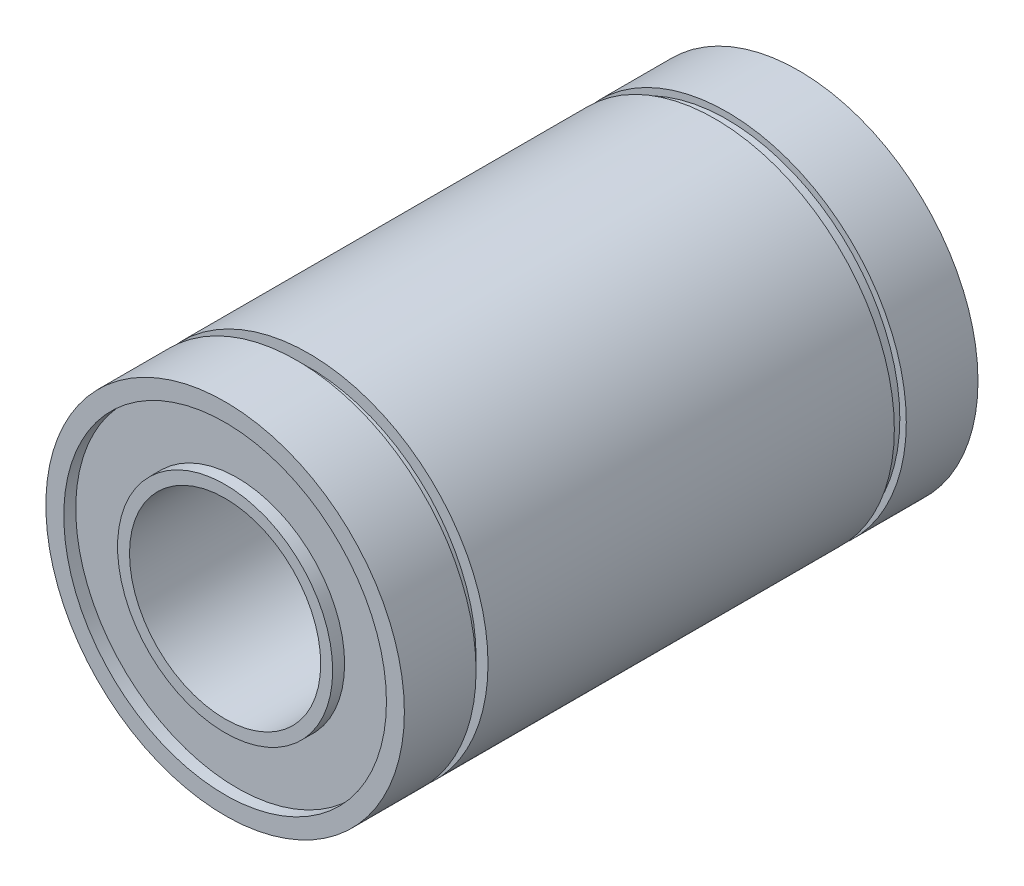
ISO-10303-21;
HEADER;
FILE_DESCRIPTION(('STEP AP214'),'2;1');
FILE_NAME('part.step','',(''),(''),'','','');
FILE_SCHEMA(('AUTOMOTIVE_DESIGN { 1 0 10303 214 1 1 1 1 }'));
ENDSEC;
DATA;
#1=APPLICATION_CONTEXT('core data for automotive mechanical design processes');
#2=APPLICATION_PROTOCOL_DEFINITION('international standard','automotive_design',2000,#1);
#3=PRODUCT_CONTEXT('',#1,'mechanical');
#4=PRODUCT('Part','Part','',(#3));
#5=PRODUCT_RELATED_PRODUCT_CATEGORY('part','',(#4));
#6=PRODUCT_DEFINITION_FORMATION('','',#4);
#7=PRODUCT_DEFINITION_CONTEXT('part definition',#1,'design');
#8=PRODUCT_DEFINITION('design','',#6,#7);
#9=PRODUCT_DEFINITION_SHAPE('','',#8);
#10=(LENGTH_UNIT() NAMED_UNIT(*) SI_UNIT(.MILLI.,.METRE.));
#11=(NAMED_UNIT(*) PLANE_ANGLE_UNIT() SI_UNIT($,.RADIAN.));
#12=(NAMED_UNIT(*) SI_UNIT($,.STERADIAN.) SOLID_ANGLE_UNIT());
#13=UNCERTAINTY_MEASURE_WITH_UNIT(LENGTH_MEASURE(1.E-05),#10,'distance_accuracy_value','');
#14=(GEOMETRIC_REPRESENTATION_CONTEXT(3) GLOBAL_UNCERTAINTY_ASSIGNED_CONTEXT((#13)) GLOBAL_UNIT_ASSIGNED_CONTEXT((#10,
#11,#12)) REPRESENTATION_CONTEXT('',''));
#15=CARTESIAN_POINT('',(0.,0.,0.));
#16=DIRECTION('',(0.,0.,1.));
#17=DIRECTION('',(1.,0.,0.));
#18=AXIS2_PLACEMENT_3D('',#15,#16,#17);
#19=CARTESIAN_POINT('',(0.,0.,0.));
#20=DIRECTION('',(0.,0.,1.));
#21=DIRECTION('',(1.,0.,0.));
#22=AXIS2_PLACEMENT_3D('',#19,#20,#21);
#23=CYLINDRICAL_SURFACE('',#22,4.);
#24=CARTESIAN_POINT('',(0.,0.,0.));
#25=DIRECTION('',(0.,0.,1.));
#26=DIRECTION('',(1.,0.,0.));
#27=AXIS2_PLACEMENT_3D('',#24,#25,#26);
#28=CIRCLE('',#27,4.);
#29=CARTESIAN_POINT('',(4.,0.,0.));
#30=VERTEX_POINT('',#29);
#31=EDGE_CURVE('E10',#30,#30,#28,.T.);
#32=ORIENTED_EDGE('',*,*,#31,.T.);
#33=EDGE_LOOP('',(#32));
#34=FACE_BOUND('',#33,.T.);
#35=CARTESIAN_POINT('',(0.,0.,-24.));
#36=DIRECTION('',(0.,0.,1.));
#37=DIRECTION('',(1.,0.,0.));
#38=AXIS2_PLACEMENT_3D('',#35,#36,#37);
#39=CIRCLE('',#38,4.);
#40=CARTESIAN_POINT('',(4.,0.,-24.));
#41=VERTEX_POINT('',#40);
#42=EDGE_CURVE('E124',#41,#41,#39,.T.);
#43=ORIENTED_EDGE('',*,*,#42,.F.);
#44=EDGE_LOOP('',(#43));
#45=FACE_BOUND('',#44,.T.);
#46=ADVANCED_FACE('F41',(#34,#45),#23,.F.);
#47=CARTESIAN_POINT('',(4.,0.,0.));
#48=DIRECTION('',(0.,0.,1.));
#49=DIRECTION('',(1.,0.,0.));
#50=AXIS2_PLACEMENT_3D('',#47,#48,#49);
#51=PLANE('',#50);
#52=CARTESIAN_POINT('',(0.,0.,0.));
#53=DIRECTION('',(0.,0.,1.));
#54=DIRECTION('',(1.,0.,0.));
#55=AXIS2_PLACEMENT_3D('',#52,#53,#54);
#56=CIRCLE('',#55,4.5);
#57=CARTESIAN_POINT('',(4.5,0.,0.));
#58=VERTEX_POINT('',#57);
#59=EDGE_CURVE('E48',#58,#58,#56,.T.);
#60=ORIENTED_EDGE('',*,*,#59,.T.);
#61=EDGE_LOOP('',(#60));
#62=FACE_BOUND('',#61,.T.);
#63=ORIENTED_EDGE('',*,*,#31,.F.);
#64=EDGE_LOOP('',(#63));
#65=FACE_BOUND('',#64,.T.);
#66=ADVANCED_FACE('F133',(#62,#65),#51,.T.);
#67=CARTESIAN_POINT('',(0.,0.,0.));
#68=DIRECTION('',(0.,0.,1.));
#69=DIRECTION('',(1.,0.,0.));
#70=AXIS2_PLACEMENT_3D('',#67,#68,#69);
#71=CYLINDRICAL_SURFACE('',#70,4.5);
#72=CARTESIAN_POINT('',(0.,0.,-0.5));
#73=DIRECTION('',(0.,0.,1.));
#74=DIRECTION('',(1.,0.,0.));
#75=AXIS2_PLACEMENT_3D('',#72,#73,#74);
#76=CIRCLE('',#75,4.5);
#77=CARTESIAN_POINT('',(4.5,0.,-0.5));
#78=VERTEX_POINT('',#77);
#79=EDGE_CURVE('E53',#78,#78,#76,.T.);
#80=ORIENTED_EDGE('',*,*,#79,.T.);
#81=EDGE_LOOP('',(#80));
#82=FACE_BOUND('',#81,.T.);
#83=ORIENTED_EDGE('',*,*,#59,.F.);
#84=EDGE_LOOP('',(#83));
#85=FACE_BOUND('',#84,.T.);
#86=ADVANCED_FACE('F137',(#82,#85),#71,.T.);
#87=CARTESIAN_POINT('',(6.75,0.,-0.5));
#88=DIRECTION('',(0.,0.,1.));
#89=DIRECTION('',(1.,0.,0.));
#90=AXIS2_PLACEMENT_3D('',#87,#88,#89);
#91=PLANE('',#90);
#92=CARTESIAN_POINT('',(0.,0.,-0.5));
#93=DIRECTION('',(0.,0.,1.));
#94=DIRECTION('',(1.,0.,0.));
#95=AXIS2_PLACEMENT_3D('',#92,#93,#94);
#96=CIRCLE('',#95,6.75);
#97=CARTESIAN_POINT('',(6.75,0.,-0.5));
#98=VERTEX_POINT('',#97);
#99=EDGE_CURVE('E58',#98,#98,#96,.T.);
#100=ORIENTED_EDGE('',*,*,#99,.T.);
#101=EDGE_LOOP('',(#100));
#102=FACE_BOUND('',#101,.T.);
#103=ORIENTED_EDGE('',*,*,#79,.F.);
#104=EDGE_LOOP('',(#103));
#105=FACE_BOUND('',#104,.T.);
#106=ADVANCED_FACE('F141',(#102,#105),#91,.T.);
#107=CARTESIAN_POINT('',(0.,0.,0.));
#108=DIRECTION('',(0.,0.,1.));
#109=DIRECTION('',(1.,0.,0.));
#110=AXIS2_PLACEMENT_3D('',#107,#108,#109);
#111=CYLINDRICAL_SURFACE('',#110,6.75);
#112=CARTESIAN_POINT('',(0.,0.,0.));
#113=DIRECTION('',(0.,0.,1.));
#114=DIRECTION('',(1.,0.,0.));
#115=AXIS2_PLACEMENT_3D('',#112,#113,#114);
#116=CIRCLE('',#115,6.75);
#117=CARTESIAN_POINT('',(6.75,0.,0.));
#118=VERTEX_POINT('',#117);
#119=EDGE_CURVE('E64',#118,#118,#116,.T.);
#120=ORIENTED_EDGE('',*,*,#119,.T.);
#121=EDGE_LOOP('',(#120));
#122=FACE_BOUND('',#121,.T.);
#123=ORIENTED_EDGE('',*,*,#99,.F.);
#124=EDGE_LOOP('',(#123));
#125=FACE_BOUND('',#124,.T.);
#126=ADVANCED_FACE('F148',(#122,#125),#111,.F.);
#127=CARTESIAN_POINT('',(6.75,0.,0.));
#128=DIRECTION('',(0.,0.,1.));
#129=DIRECTION('',(1.,0.,0.));
#130=AXIS2_PLACEMENT_3D('',#127,#128,#129);
#131=PLANE('',#130);
#132=CARTESIAN_POINT('',(0.,0.,0.));
#133=DIRECTION('',(0.,0.,1.));
#134=DIRECTION('',(1.,0.,0.));
#135=AXIS2_PLACEMENT_3D('',#132,#133,#134);
#136=CIRCLE('',#135,7.5);
#137=CARTESIAN_POINT('',(7.5,0.,0.));
#138=VERTEX_POINT('',#137);
#139=EDGE_CURVE('E68',#138,#138,#136,.T.);
#140=ORIENTED_EDGE('',*,*,#139,.T.);
#141=EDGE_LOOP('',(#140));
#142=FACE_BOUND('',#141,.T.);
#143=ORIENTED_EDGE('',*,*,#119,.F.);
#144=EDGE_LOOP('',(#143));
#145=FACE_BOUND('',#144,.T.);
#146=ADVANCED_FACE('F152',(#142,#145),#131,.T.);
#147=CARTESIAN_POINT('',(0.,0.,0.));
#148=DIRECTION('',(0.,0.,1.));
#149=DIRECTION('',(1.,0.,0.));
#150=AXIS2_PLACEMENT_3D('',#147,#148,#149);
#151=CYLINDRICAL_SURFACE('',#150,7.5);
#152=CARTESIAN_POINT('',(0.,0.,-3.));
#153=DIRECTION('',(0.,0.,1.));
#154=DIRECTION('',(1.,0.,0.));
#155=AXIS2_PLACEMENT_3D('',#152,#153,#154);
#156=CIRCLE('',#155,7.5);
#157=CARTESIAN_POINT('',(7.5,0.,-3.));
#158=VERTEX_POINT('',#157);
#159=EDGE_CURVE('E72',#158,#158,#156,.T.);
#160=ORIENTED_EDGE('',*,*,#159,.T.);
#161=EDGE_LOOP('',(#160));
#162=FACE_BOUND('',#161,.T.);
#163=ORIENTED_EDGE('',*,*,#139,.F.);
#164=EDGE_LOOP('',(#163));
#165=FACE_BOUND('',#164,.T.);
#166=ADVANCED_FACE('F156',(#162,#165),#151,.T.);
#167=CARTESIAN_POINT('',(7.5,0.,-3.));
#168=DIRECTION('',(0.,0.,-1.));
#169=DIRECTION('',(-1.,0.,0.));
#170=AXIS2_PLACEMENT_3D('',#167,#168,#169);
#171=PLANE('',#170);
#172=CARTESIAN_POINT('',(0.,0.,-3.));
#173=DIRECTION('',(0.,0.,1.));
#174=DIRECTION('',(1.,0.,0.));
#175=AXIS2_PLACEMENT_3D('',#172,#173,#174);
#176=CIRCLE('',#175,7.);
#177=CARTESIAN_POINT('',(7.,0.,-3.));
#178=VERTEX_POINT('',#177);
#179=EDGE_CURVE('E76',#178,#178,#176,.T.);
#180=ORIENTED_EDGE('',*,*,#179,.T.);
#181=EDGE_LOOP('',(#180));
#182=FACE_BOUND('',#181,.T.);
#183=ORIENTED_EDGE('',*,*,#159,.F.);
#184=EDGE_LOOP('',(#183));
#185=FACE_BOUND('',#184,.T.);
#186=ADVANCED_FACE('F160',(#182,#185),#171,.T.);
#187=CARTESIAN_POINT('',(0.,0.,0.));
#188=DIRECTION('',(0.,0.,1.));
#189=DIRECTION('',(1.,0.,0.));
#190=AXIS2_PLACEMENT_3D('',#187,#188,#189);
#191=CYLINDRICAL_SURFACE('',#190,7.);
#192=CARTESIAN_POINT('',(0.,0.,-3.5));
#193=DIRECTION('',(0.,0.,1.));
#194=DIRECTION('',(1.,0.,0.));
#195=AXIS2_PLACEMENT_3D('',#192,#193,#194);
#196=CIRCLE('',#195,7.);
#197=CARTESIAN_POINT('',(7.,0.,-3.5));
#198=VERTEX_POINT('',#197);
#199=EDGE_CURVE('E80',#198,#198,#196,.T.);
#200=ORIENTED_EDGE('',*,*,#199,.T.);
#201=EDGE_LOOP('',(#200));
#202=FACE_BOUND('',#201,.T.);
#203=ORIENTED_EDGE('',*,*,#179,.F.);
#204=EDGE_LOOP('',(#203));
#205=FACE_BOUND('',#204,.T.);
#206=ADVANCED_FACE('F164',(#202,#205),#191,.T.);
#207=CARTESIAN_POINT('',(7.,0.,-3.5));
#208=DIRECTION('',(0.,0.,1.));
#209=DIRECTION('',(1.,0.,0.));
#210=AXIS2_PLACEMENT_3D('',#207,#208,#209);
#211=PLANE('',#210);
#212=CARTESIAN_POINT('',(0.,0.,-3.5));
#213=DIRECTION('',(0.,0.,1.));
#214=DIRECTION('',(1.,0.,0.));
#215=AXIS2_PLACEMENT_3D('',#212,#213,#214);
#216=CIRCLE('',#215,7.5);
#217=CARTESIAN_POINT('',(7.5,0.,-3.5));
#218=VERTEX_POINT('',#217);
#219=EDGE_CURVE('E84',#218,#218,#216,.T.);
#220=ORIENTED_EDGE('',*,*,#219,.T.);
#221=EDGE_LOOP('',(#220));
#222=FACE_BOUND('',#221,.T.);
#223=ORIENTED_EDGE('',*,*,#199,.F.);
#224=EDGE_LOOP('',(#223));
#225=FACE_BOUND('',#224,.T.);
#226=ADVANCED_FACE('F168',(#222,#225),#211,.T.);
#227=CARTESIAN_POINT('',(0.,0.,0.));
#228=DIRECTION('',(0.,0.,1.));
#229=DIRECTION('',(1.,0.,0.));
#230=AXIS2_PLACEMENT_3D('',#227,#228,#229);
#231=CYLINDRICAL_SURFACE('',#230,7.5);
#232=CARTESIAN_POINT('',(0.,0.,-20.5));
#233=DIRECTION('',(0.,0.,1.));
#234=DIRECTION('',(1.,0.,0.));
#235=AXIS2_PLACEMENT_3D('',#232,#233,#234);
#236=CIRCLE('',#235,7.5);
#237=CARTESIAN_POINT('',(7.5,0.,-20.5));
#238=VERTEX_POINT('',#237);
#239=EDGE_CURVE('E88',#238,#238,#236,.T.);
#240=ORIENTED_EDGE('',*,*,#239,.T.);
#241=EDGE_LOOP('',(#240));
#242=FACE_BOUND('',#241,.T.);
#243=ORIENTED_EDGE('',*,*,#219,.F.);
#244=EDGE_LOOP('',(#243));
#245=FACE_BOUND('',#244,.T.);
#246=ADVANCED_FACE('F172',(#242,#245),#231,.T.);
#247=CARTESIAN_POINT('',(7.5,0.,-20.5));
#248=DIRECTION('',(0.,0.,-1.));
#249=DIRECTION('',(-1.,0.,0.));
#250=AXIS2_PLACEMENT_3D('',#247,#248,#249);
#251=PLANE('',#250);
#252=CARTESIAN_POINT('',(0.,0.,-20.5));
#253=DIRECTION('',(0.,0.,1.));
#254=DIRECTION('',(1.,0.,0.));
#255=AXIS2_PLACEMENT_3D('',#252,#253,#254);
#256=CIRCLE('',#255,7.22984405936301);
#257=CARTESIAN_POINT('',(7.22984405936301,0.,-20.5));
#258=VERTEX_POINT('',#257);
#259=EDGE_CURVE('E92',#258,#258,#256,.T.);
#260=ORIENTED_EDGE('',*,*,#259,.T.);
#261=EDGE_LOOP('',(#260));
#262=FACE_BOUND('',#261,.T.);
#263=ORIENTED_EDGE('',*,*,#239,.F.);
#264=EDGE_LOOP('',(#263));
#265=FACE_BOUND('',#264,.T.);
#266=ADVANCED_FACE('F176',(#262,#265),#251,.T.);
#267=CARTESIAN_POINT('',(0.,0.,0.));
#268=DIRECTION('',(0.,0.,1.));
#269=DIRECTION('',(1.,0.,0.));
#270=AXIS2_PLACEMENT_3D('',#267,#268,#269);
#271=CYLINDRICAL_SURFACE('',#270,7.22984405936301);
#272=CARTESIAN_POINT('',(0.,0.,-21.));
#273=DIRECTION('',(0.,0.,1.));
#274=DIRECTION('',(1.,0.,0.));
#275=AXIS2_PLACEMENT_3D('',#272,#273,#274);
#276=CIRCLE('',#275,7.22984405936301);
#277=CARTESIAN_POINT('',(7.22984405936301,0.,-21.));
#278=VERTEX_POINT('',#277);
#279=EDGE_CURVE('E96',#278,#278,#276,.T.);
#280=ORIENTED_EDGE('',*,*,#279,.T.);
#281=EDGE_LOOP('',(#280));
#282=FACE_BOUND('',#281,.T.);
#283=ORIENTED_EDGE('',*,*,#259,.F.);
#284=EDGE_LOOP('',(#283));
#285=FACE_BOUND('',#284,.T.);
#286=ADVANCED_FACE('F180',(#282,#285),#271,.T.);
#287=CARTESIAN_POINT('',(7.22984405936301,0.,-21.));
#288=DIRECTION('',(0.,0.,1.));
#289=DIRECTION('',(1.,0.,0.));
#290=AXIS2_PLACEMENT_3D('',#287,#288,#289);
#291=PLANE('',#290);
#292=CARTESIAN_POINT('',(0.,0.,-21.));
#293=DIRECTION('',(0.,0.,1.));
#294=DIRECTION('',(1.,0.,0.));
#295=AXIS2_PLACEMENT_3D('',#292,#293,#294);
#296=CIRCLE('',#295,7.5);
#297=CARTESIAN_POINT('',(7.5,0.,-21.));
#298=VERTEX_POINT('',#297);
#299=EDGE_CURVE('E100',#298,#298,#296,.T.);
#300=ORIENTED_EDGE('',*,*,#299,.T.);
#301=EDGE_LOOP('',(#300));
#302=FACE_BOUND('',#301,.T.);
#303=ORIENTED_EDGE('',*,*,#279,.F.);
#304=EDGE_LOOP('',(#303));
#305=FACE_BOUND('',#304,.T.);
#306=ADVANCED_FACE('F184',(#302,#305),#291,.T.);
#307=CARTESIAN_POINT('',(0.,0.,0.));
#308=DIRECTION('',(0.,0.,1.));
#309=DIRECTION('',(1.,0.,0.));
#310=AXIS2_PLACEMENT_3D('',#307,#308,#309);
#311=CYLINDRICAL_SURFACE('',#310,7.5);
#312=CARTESIAN_POINT('',(0.,0.,-24.));
#313=DIRECTION('',(0.,0.,1.));
#314=DIRECTION('',(1.,0.,0.));
#315=AXIS2_PLACEMENT_3D('',#312,#313,#314);
#316=CIRCLE('',#315,7.5);
#317=CARTESIAN_POINT('',(7.5,0.,-24.));
#318=VERTEX_POINT('',#317);
#319=EDGE_CURVE('E104',#318,#318,#316,.T.);
#320=ORIENTED_EDGE('',*,*,#319,.T.);
#321=EDGE_LOOP('',(#320));
#322=FACE_BOUND('',#321,.T.);
#323=ORIENTED_EDGE('',*,*,#299,.F.);
#324=EDGE_LOOP('',(#323));
#325=FACE_BOUND('',#324,.T.);
#326=ADVANCED_FACE('F188',(#322,#325),#311,.T.);
#327=CARTESIAN_POINT('',(7.5,0.,-24.));
#328=DIRECTION('',(0.,0.,-1.));
#329=DIRECTION('',(-1.,0.,0.));
#330=AXIS2_PLACEMENT_3D('',#327,#328,#329);
#331=PLANE('',#330);
#332=CARTESIAN_POINT('',(0.,0.,-24.));
#333=DIRECTION('',(0.,0.,1.));
#334=DIRECTION('',(1.,0.,0.));
#335=AXIS2_PLACEMENT_3D('',#332,#333,#334);
#336=CIRCLE('',#335,6.75);
#337=CARTESIAN_POINT('',(6.75,0.,-24.));
#338=VERTEX_POINT('',#337);
#339=EDGE_CURVE('E108',#338,#338,#336,.T.);
#340=ORIENTED_EDGE('',*,*,#339,.T.);
#341=EDGE_LOOP('',(#340));
#342=FACE_BOUND('',#341,.T.);
#343=ORIENTED_EDGE('',*,*,#319,.F.);
#344=EDGE_LOOP('',(#343));
#345=FACE_BOUND('',#344,.T.);
#346=ADVANCED_FACE('F192',(#342,#345),#331,.T.);
#347=CARTESIAN_POINT('',(0.,0.,0.));
#348=DIRECTION('',(0.,0.,1.));
#349=DIRECTION('',(1.,0.,0.));
#350=AXIS2_PLACEMENT_3D('',#347,#348,#349);
#351=CYLINDRICAL_SURFACE('',#350,6.75);
#352=CARTESIAN_POINT('',(0.,0.,-23.5));
#353=DIRECTION('',(0.,0.,1.));
#354=DIRECTION('',(1.,0.,0.));
#355=AXIS2_PLACEMENT_3D('',#352,#353,#354);
#356=CIRCLE('',#355,6.75);
#357=CARTESIAN_POINT('',(6.75,0.,-23.5));
#358=VERTEX_POINT('',#357);
#359=EDGE_CURVE('E112',#358,#358,#356,.T.);
#360=ORIENTED_EDGE('',*,*,#359,.T.);
#361=EDGE_LOOP('',(#360));
#362=FACE_BOUND('',#361,.T.);
#363=ORIENTED_EDGE('',*,*,#339,.F.);
#364=EDGE_LOOP('',(#363));
#365=FACE_BOUND('',#364,.T.);
#366=ADVANCED_FACE('F196',(#362,#365),#351,.F.);
#367=CARTESIAN_POINT('',(6.75,0.,-23.5));
#368=DIRECTION('',(0.,0.,-1.));
#369=DIRECTION('',(-1.,0.,0.));
#370=AXIS2_PLACEMENT_3D('',#367,#368,#369);
#371=PLANE('',#370);
#372=CARTESIAN_POINT('',(0.,0.,-23.5));
#373=DIRECTION('',(0.,0.,1.));
#374=DIRECTION('',(1.,0.,0.));
#375=AXIS2_PLACEMENT_3D('',#372,#373,#374);
#376=CIRCLE('',#375,4.5);
#377=CARTESIAN_POINT('',(4.5,0.,-23.5));
#378=VERTEX_POINT('',#377);
#379=EDGE_CURVE('E116',#378,#378,#376,.T.);
#380=ORIENTED_EDGE('',*,*,#379,.T.);
#381=EDGE_LOOP('',(#380));
#382=FACE_BOUND('',#381,.T.);
#383=ORIENTED_EDGE('',*,*,#359,.F.);
#384=EDGE_LOOP('',(#383));
#385=FACE_BOUND('',#384,.T.);
#386=ADVANCED_FACE('F200',(#382,#385),#371,.T.);
#387=CARTESIAN_POINT('',(0.,0.,0.));
#388=DIRECTION('',(0.,0.,1.));
#389=DIRECTION('',(1.,0.,0.));
#390=AXIS2_PLACEMENT_3D('',#387,#388,#389);
#391=CYLINDRICAL_SURFACE('',#390,4.5);
#392=CARTESIAN_POINT('',(0.,0.,-24.));
#393=DIRECTION('',(0.,0.,1.));
#394=DIRECTION('',(1.,0.,0.));
#395=AXIS2_PLACEMENT_3D('',#392,#393,#394);
#396=CIRCLE('',#395,4.5);
#397=CARTESIAN_POINT('',(4.5,0.,-24.));
#398=VERTEX_POINT('',#397);
#399=EDGE_CURVE('E120',#398,#398,#396,.T.);
#400=ORIENTED_EDGE('',*,*,#399,.T.);
#401=EDGE_LOOP('',(#400));
#402=FACE_BOUND('',#401,.T.);
#403=ORIENTED_EDGE('',*,*,#379,.F.);
#404=EDGE_LOOP('',(#403));
#405=FACE_BOUND('',#404,.T.);
#406=ADVANCED_FACE('F204',(#402,#405),#391,.T.);
#407=CARTESIAN_POINT('',(4.5,0.,-24.));
#408=DIRECTION('',(0.,0.,-1.));
#409=DIRECTION('',(-1.,0.,0.));
#410=AXIS2_PLACEMENT_3D('',#407,#408,#409);
#411=PLANE('',#410);
#412=ORIENTED_EDGE('',*,*,#42,.T.);
#413=EDGE_LOOP('',(#412));
#414=FACE_BOUND('',#413,.T.);
#415=ORIENTED_EDGE('',*,*,#399,.F.);
#416=EDGE_LOOP('',(#415));
#417=FACE_BOUND('',#416,.T.);
#418=ADVANCED_FACE('F129',(#414,#417),#411,.T.);
#419=CLOSED_SHELL('',(#46,#66,#86,#106,#126,#146,#166,#186,#206,#226,#246,#266,#286,#306,#326,
#346,#366,#386,#406,#418));
#420=MANIFOLD_SOLID_BREP('B2',#419);
#421=ADVANCED_BREP_SHAPE_REPRESENTATION('',(#18,#420),#14);
#422=SHAPE_DEFINITION_REPRESENTATION(#9,#421);
ENDSEC;
END-ISO-10303-21;
